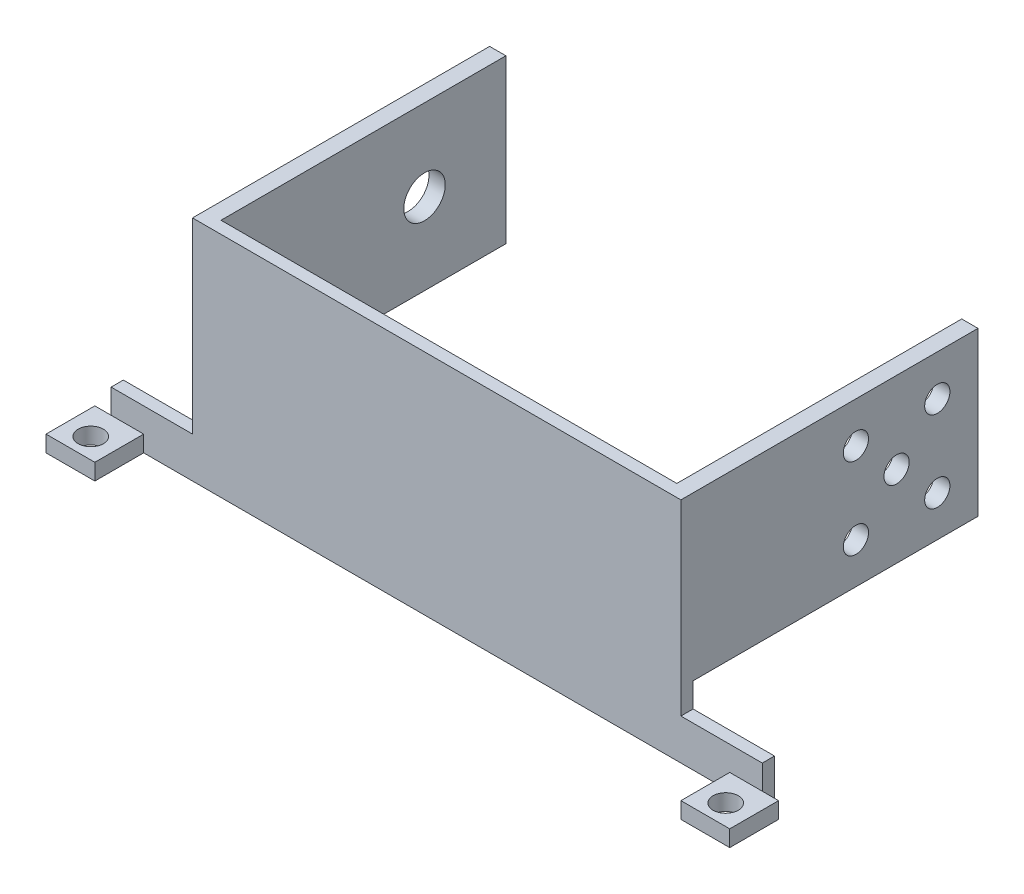
ISO-10303-21;
HEADER;
FILE_DESCRIPTION(('STEP AP214'),'2;1');
FILE_NAME('part.step','',(''),(''),'','','');
FILE_SCHEMA(('AUTOMOTIVE_DESIGN { 1 0 10303 214 1 1 1 1 }'));
ENDSEC;
DATA;
#1=APPLICATION_CONTEXT('core data for automotive mechanical design processes');
#2=APPLICATION_PROTOCOL_DEFINITION('international standard','automotive_design',2000,#1);
#3=PRODUCT_CONTEXT('',#1,'mechanical');
#4=PRODUCT('Part','Part','',(#3));
#5=PRODUCT_RELATED_PRODUCT_CATEGORY('part','',(#4));
#6=PRODUCT_DEFINITION_FORMATION('','',#4);
#7=PRODUCT_DEFINITION_CONTEXT('part definition',#1,'design');
#8=PRODUCT_DEFINITION('design','',#6,#7);
#9=PRODUCT_DEFINITION_SHAPE('','',#8);
#10=(LENGTH_UNIT() NAMED_UNIT(*) SI_UNIT(.MILLI.,.METRE.));
#11=(NAMED_UNIT(*) PLANE_ANGLE_UNIT() SI_UNIT($,.RADIAN.));
#12=(NAMED_UNIT(*) SI_UNIT($,.STERADIAN.) SOLID_ANGLE_UNIT());
#13=UNCERTAINTY_MEASURE_WITH_UNIT(LENGTH_MEASURE(1.E-05),#10,'distance_accuracy_value','');
#14=(GEOMETRIC_REPRESENTATION_CONTEXT(3) GLOBAL_UNCERTAINTY_ASSIGNED_CONTEXT((#13)) GLOBAL_UNIT_ASSIGNED_CONTEXT((#10,
#11,#12)) REPRESENTATION_CONTEXT('',''));
#15=CARTESIAN_POINT('',(0.,0.,0.));
#16=DIRECTION('',(0.,0.,1.));
#17=DIRECTION('',(1.,0.,0.));
#18=AXIS2_PLACEMENT_3D('',#15,#16,#17);
#19=CARTESIAN_POINT('',(0.,0.,0.));
#20=DIRECTION('',(0.,0.,1.));
#21=DIRECTION('',(1.,0.,0.));
#22=AXIS2_PLACEMENT_3D('',#19,#20,#21);
#23=PLANE('',#22);
#24=DIRECTION('',(-1.,0.,0.));
#25=VECTOR('',#24,1.);
#26=CARTESIAN_POINT('',(30.,-3.99999999999999,0.));
#27=LINE('',#26,#25);
#28=CARTESIAN_POINT('',(30.,-3.99999999999999,0.));
#29=VERTEX_POINT('',#28);
#30=CARTESIAN_POINT('',(28.,-4.,0.));
#31=VERTEX_POINT('',#30);
#32=EDGE_CURVE('E390',#29,#31,#27,.T.);
#33=ORIENTED_EDGE('',*,*,#32,.F.);
#34=DIRECTION('',(0.,1.,0.));
#35=VECTOR('',#34,1.);
#36=CARTESIAN_POINT('',(30.,12.,0.));
#37=LINE('',#36,#35);
#38=CARTESIAN_POINT('',(30.,-7.,0.));
#39=VERTEX_POINT('',#38);
#40=EDGE_CURVE('E218',#39,#29,#37,.T.);
#41=ORIENTED_EDGE('',*,*,#40,.F.);
#42=DIRECTION('',(-1.,0.,0.));
#43=VECTOR('',#42,1.);
#44=CARTESIAN_POINT('',(40.,-7.,0.));
#45=LINE('',#44,#43);
#46=CARTESIAN_POINT('',(40.,-7.,0.));
#47=VERTEX_POINT('',#46);
#48=EDGE_CURVE('E318',#47,#39,#45,.T.);
#49=ORIENTED_EDGE('',*,*,#48,.F.);
#50=DIRECTION('',(0.,1.,0.));
#51=VECTOR('',#50,1.);
#52=CARTESIAN_POINT('',(40.,-7.,0.));
#53=LINE('',#52,#51);
#54=CARTESIAN_POINT('',(40.,-12.,0.));
#55=VERTEX_POINT('',#54);
#56=EDGE_CURVE('E320',#55,#47,#53,.T.);
#57=ORIENTED_EDGE('',*,*,#56,.F.);
#58=DIRECTION('',(1.,0.,0.));
#59=VECTOR('',#58,1.);
#60=CARTESIAN_POINT('',(-30.,-12.,0.));
#61=LINE('',#60,#59);
#62=CARTESIAN_POINT('',(-40.,-12.,0.));
#63=VERTEX_POINT('',#62);
#64=EDGE_CURVE('E357',#63,#55,#61,.T.);
#65=ORIENTED_EDGE('',*,*,#64,.F.);
#66=DIRECTION('',(0.,-1.,0.));
#67=VECTOR('',#66,1.);
#68=CARTESIAN_POINT('',(-40.,-7.,0.));
#69=LINE('',#68,#67);
#70=CARTESIAN_POINT('',(-40.,-7.,0.));
#71=VERTEX_POINT('',#70);
#72=EDGE_CURVE('E336',#71,#63,#69,.T.);
#73=ORIENTED_EDGE('',*,*,#72,.F.);
#74=DIRECTION('',(-1.,0.,0.));
#75=VECTOR('',#74,1.);
#76=CARTESIAN_POINT('',(-27.,-7.,0.));
#77=LINE('',#76,#75);
#78=CARTESIAN_POINT('',(-30.,-7.,0.));
#79=VERTEX_POINT('',#78);
#80=EDGE_CURVE('E339',#79,#71,#77,.T.);
#81=ORIENTED_EDGE('',*,*,#80,.F.);
#82=DIRECTION('',(0.,-1.,0.));
#83=VECTOR('',#82,1.);
#84=CARTESIAN_POINT('',(-30.,12.,0.));
#85=LINE('',#84,#83);
#86=CARTESIAN_POINT('',(-30.,-4.,0.));
#87=VERTEX_POINT('',#86);
#88=EDGE_CURVE('E367',#87,#79,#85,.T.);
#89=ORIENTED_EDGE('',*,*,#88,.F.);
#90=DIRECTION('',(-1.,0.,0.));
#91=VECTOR('',#90,1.);
#92=CARTESIAN_POINT('',(-30.,-4.,0.));
#93=LINE('',#92,#91);
#94=CARTESIAN_POINT('',(-28.,-4.,0.));
#95=VERTEX_POINT('',#94);
#96=EDGE_CURVE('E222',#95,#87,#93,.T.);
#97=ORIENTED_EDGE('',*,*,#96,.F.);
#98=DIRECTION('',(0.,-1.,0.));
#99=VECTOR('',#98,1.);
#100=CARTESIAN_POINT('',(-28.,16.,0.));
#101=LINE('',#100,#99);
#102=CARTESIAN_POINT('',(-28.,16.,0.));
#103=VERTEX_POINT('',#102);
#104=EDGE_CURVE('E219',#103,#95,#101,.T.);
#105=ORIENTED_EDGE('',*,*,#104,.F.);
#106=DIRECTION('',(-1.,0.,0.));
#107=VECTOR('',#106,1.);
#108=CARTESIAN_POINT('',(-30.,16.,0.));
#109=LINE('',#108,#107);
#110=CARTESIAN_POINT('',(28.,16.,0.));
#111=VERTEX_POINT('',#110);
#112=EDGE_CURVE('E58',#111,#103,#109,.T.);
#113=ORIENTED_EDGE('',*,*,#112,.F.);
#114=DIRECTION('',(0.,1.,0.));
#115=VECTOR('',#114,1.);
#116=CARTESIAN_POINT('',(28.,16.,0.));
#117=LINE('',#116,#115);
#118=EDGE_CURVE('E212',#31,#111,#117,.T.);
#119=ORIENTED_EDGE('',*,*,#118,.F.);
#120=EDGE_LOOP('',(#33,#41,#49,#57,#65,#73,#81,#89,#97,#105,#113,#119));
#121=FACE_BOUND('',#120,.T.);
#122=ADVANCED_FACE('F35',(#121),#23,.F.);
#123=CARTESIAN_POINT('',(0.,0.,1.5));
#124=DIRECTION('',(0.,0.,1.));
#125=DIRECTION('',(1.,0.,0.));
#126=AXIS2_PLACEMENT_3D('',#123,#124,#125);
#127=PLANE('',#126);
#128=DIRECTION('',(-1.,0.,0.));
#129=VECTOR('',#128,1.);
#130=CARTESIAN_POINT('',(-36.,-10.,1.5));
#131=LINE('',#130,#129);
#132=CARTESIAN_POINT('',(-36.,-10.,1.5));
#133=VERTEX_POINT('',#132);
#134=CARTESIAN_POINT('',(-40.,-10.,1.5));
#135=VERTEX_POINT('',#134);
#136=EDGE_CURVE('E270',#133,#135,#131,.T.);
#137=ORIENTED_EDGE('',*,*,#136,.F.);
#138=DIRECTION('',(0.,1.,0.));
#139=VECTOR('',#138,1.);
#140=CARTESIAN_POINT('',(-36.,-10.,1.5));
#141=LINE('',#140,#139);
#142=CARTESIAN_POINT('',(-36.,-12.,1.5));
#143=VERTEX_POINT('',#142);
#144=EDGE_CURVE('E265',#143,#133,#141,.T.);
#145=ORIENTED_EDGE('',*,*,#144,.F.);
#146=DIRECTION('',(1.,0.,0.));
#147=VECTOR('',#146,1.);
#148=CARTESIAN_POINT('',(-30.,-12.,1.5));
#149=LINE('',#148,#147);
#150=CARTESIAN_POINT('',(36.,-12.,1.5));
#151=VERTEX_POINT('',#150);
#152=EDGE_CURVE('E362',#143,#151,#149,.T.);
#153=ORIENTED_EDGE('',*,*,#152,.T.);
#154=DIRECTION('',(0.,-1.,0.));
#155=VECTOR('',#154,1.);
#156=CARTESIAN_POINT('',(36.,-10.,1.5));
#157=LINE('',#156,#155);
#158=CARTESIAN_POINT('',(36.,-10.,1.5));
#159=VERTEX_POINT('',#158);
#160=EDGE_CURVE('E288',#159,#151,#157,.T.);
#161=ORIENTED_EDGE('',*,*,#160,.F.);
#162=DIRECTION('',(-1.,0.,0.));
#163=VECTOR('',#162,1.);
#164=CARTESIAN_POINT('',(36.,-10.,1.5));
#165=LINE('',#164,#163);
#166=CARTESIAN_POINT('',(40.,-10.,1.5));
#167=VERTEX_POINT('',#166);
#168=EDGE_CURVE('E11',#167,#159,#165,.T.);
#169=ORIENTED_EDGE('',*,*,#168,.F.);
#170=DIRECTION('',(0.,1.,0.));
#171=VECTOR('',#170,1.);
#172=CARTESIAN_POINT('',(40.,-7.,1.5));
#173=LINE('',#172,#171);
#174=CARTESIAN_POINT('',(40.,-7.,1.5));
#175=VERTEX_POINT('',#174);
#176=EDGE_CURVE('E326',#167,#175,#173,.T.);
#177=ORIENTED_EDGE('',*,*,#176,.T.);
#178=DIRECTION('',(-1.,0.,0.));
#179=VECTOR('',#178,1.);
#180=CARTESIAN_POINT('',(27.,-7.,1.5));
#181=LINE('',#180,#179);
#182=CARTESIAN_POINT('',(30.,-7.,1.5));
#183=VERTEX_POINT('',#182);
#184=EDGE_CURVE('E317',#175,#183,#181,.T.);
#185=ORIENTED_EDGE('',*,*,#184,.T.);
#186=DIRECTION('',(0.,1.,0.));
#187=VECTOR('',#186,1.);
#188=CARTESIAN_POINT('',(30.,12.,1.5));
#189=LINE('',#188,#187);
#190=CARTESIAN_POINT('',(30.,16.,1.5));
#191=VERTEX_POINT('',#190);
#192=EDGE_CURVE('E354',#183,#191,#189,.T.);
#193=ORIENTED_EDGE('',*,*,#192,.T.);
#194=DIRECTION('',(-1.,0.,0.));
#195=VECTOR('',#194,1.);
#196=CARTESIAN_POINT('',(-30.,16.,1.5));
#197=LINE('',#196,#195);
#198=CARTESIAN_POINT('',(-30.,16.,1.5));
#199=VERTEX_POINT('',#198);
#200=EDGE_CURVE('E356',#191,#199,#197,.T.);
#201=ORIENTED_EDGE('',*,*,#200,.T.);
#202=DIRECTION('',(0.,-1.,0.));
#203=VECTOR('',#202,1.);
#204=CARTESIAN_POINT('',(-30.,12.,1.5));
#205=LINE('',#204,#203);
#206=CARTESIAN_POINT('',(-30.,-7.,1.5));
#207=VERTEX_POINT('',#206);
#208=EDGE_CURVE('E359',#199,#207,#205,.T.);
#209=ORIENTED_EDGE('',*,*,#208,.T.);
#210=DIRECTION('',(-1.,0.,0.));
#211=VECTOR('',#210,1.);
#212=CARTESIAN_POINT('',(-40.,-7.,1.5));
#213=LINE('',#212,#211);
#214=CARTESIAN_POINT('',(-40.,-7.,1.5));
#215=VERTEX_POINT('',#214);
#216=EDGE_CURVE('E340',#207,#215,#213,.T.);
#217=ORIENTED_EDGE('',*,*,#216,.T.);
#218=DIRECTION('',(0.,-1.,0.));
#219=VECTOR('',#218,1.);
#220=CARTESIAN_POINT('',(-40.,-7.,1.5));
#221=LINE('',#220,#219);
#222=EDGE_CURVE('E343',#215,#135,#221,.T.);
#223=ORIENTED_EDGE('',*,*,#222,.T.);
#224=EDGE_LOOP('',(#137,#145,#153,#161,#169,#177,#185,#193,#201,#209,#217,#223));
#225=FACE_BOUND('',#224,.T.);
#226=ADVANCED_FACE('F434',(#225),#127,.T.);
#227=CARTESIAN_POINT('',(30.,12.,1.5));
#228=DIRECTION('',(-1.,0.,0.));
#229=DIRECTION('',(0.,0.,1.));
#230=AXIS2_PLACEMENT_3D('',#227,#228,#229);
#231=PLANE('',#230);
#232=CARTESIAN_POINT('',(30.,11.,-20.));
#233=DIRECTION('',(1.,0.,0.));
#234=DIRECTION('',(0.,0.,-1.));
#235=AXIS2_PLACEMENT_3D('',#232,#233,#234);
#236=CIRCLE('',#235,1.55);
#237=CARTESIAN_POINT('',(30.,11.,-21.55));
#238=VERTEX_POINT('',#237);
#239=EDGE_CURVE('E401',#238,#238,#236,.T.);
#240=ORIENTED_EDGE('',*,*,#239,.F.);
#241=EDGE_LOOP('',(#240));
#242=FACE_BOUND('',#241,.T.);
#243=CARTESIAN_POINT('',(30.,1.00000000000003,-20.));
#244=DIRECTION('',(1.,0.,0.));
#245=DIRECTION('',(0.,0.,1.));
#246=AXIS2_PLACEMENT_3D('',#243,#244,#245);
#247=CIRCLE('',#246,1.55);
#248=CARTESIAN_POINT('',(30.,1.00000000000003,-18.45));
#249=VERTEX_POINT('',#248);
#250=EDGE_CURVE('E404',#249,#249,#247,.T.);
#251=ORIENTED_EDGE('',*,*,#250,.F.);
#252=EDGE_LOOP('',(#251));
#253=FACE_BOUND('',#252,.T.);
#254=CARTESIAN_POINT('',(30.,1.00000000000001,-30.));
#255=DIRECTION('',(1.,0.,0.));
#256=DIRECTION('',(0.,0.,1.));
#257=AXIS2_PLACEMENT_3D('',#254,#255,#256);
#258=CIRCLE('',#257,1.55);
#259=CARTESIAN_POINT('',(30.,1.00000000000001,-28.45));
#260=VERTEX_POINT('',#259);
#261=EDGE_CURVE('E407',#260,#260,#258,.T.);
#262=ORIENTED_EDGE('',*,*,#261,.F.);
#263=EDGE_LOOP('',(#262));
#264=FACE_BOUND('',#263,.T.);
#265=CARTESIAN_POINT('',(30.,11.,-30.));
#266=DIRECTION('',(1.,0.,0.));
#267=DIRECTION('',(0.,0.,-1.));
#268=AXIS2_PLACEMENT_3D('',#265,#266,#267);
#269=CIRCLE('',#268,1.55);
#270=CARTESIAN_POINT('',(30.,11.,-31.55));
#271=VERTEX_POINT('',#270);
#272=EDGE_CURVE('E400',#271,#271,#269,.T.);
#273=ORIENTED_EDGE('',*,*,#272,.F.);
#274=EDGE_LOOP('',(#273));
#275=FACE_BOUND('',#274,.T.);
#276=CARTESIAN_POINT('',(30.,6.00000000000001,-25.));
#277=DIRECTION('',(1.,0.,0.));
#278=DIRECTION('',(0.,0.,-1.));
#279=AXIS2_PLACEMENT_3D('',#276,#277,#278);
#280=CIRCLE('',#279,1.55);
#281=CARTESIAN_POINT('',(30.,6.00000000000001,-26.55));
#282=VERTEX_POINT('',#281);
#283=EDGE_CURVE('E380',#282,#282,#280,.T.);
#284=ORIENTED_EDGE('',*,*,#283,.F.);
#285=EDGE_LOOP('',(#284));
#286=FACE_BOUND('',#285,.T.);
#287=ORIENTED_EDGE('',*,*,#192,.F.);
#288=DIRECTION('',(0.,0.,-1.));
#289=VECTOR('',#288,1.);
#290=CARTESIAN_POINT('',(30.,-7.,1.5));
#291=LINE('',#290,#289);
#292=EDGE_CURVE('E332',#183,#39,#291,.T.);
#293=ORIENTED_EDGE('',*,*,#292,.T.);
#294=ORIENTED_EDGE('',*,*,#40,.T.);
#295=DIRECTION('',(0.,0.,1.));
#296=VECTOR('',#295,1.);
#297=CARTESIAN_POINT('',(30.,-3.99999999999999,-35.));
#298=LINE('',#297,#296);
#299=CARTESIAN_POINT('',(30.,-3.99999999999999,-35.));
#300=VERTEX_POINT('',#299);
#301=EDGE_CURVE('E197',#300,#29,#298,.T.);
#302=ORIENTED_EDGE('',*,*,#301,.F.);
#303=DIRECTION('',(0.,-1.,0.));
#304=VECTOR('',#303,1.);
#305=CARTESIAN_POINT('',(30.,16.,-35.));
#306=LINE('',#305,#304);
#307=CARTESIAN_POINT('',(30.,16.,-35.));
#308=VERTEX_POINT('',#307);
#309=EDGE_CURVE('E204',#308,#300,#306,.T.);
#310=ORIENTED_EDGE('',*,*,#309,.F.);
#311=DIRECTION('',(0.,0.,-1.));
#312=VECTOR('',#311,1.);
#313=CARTESIAN_POINT('',(30.,16.,1.5));
#314=LINE('',#313,#312);
#315=EDGE_CURVE('E44',#191,#308,#314,.T.);
#316=ORIENTED_EDGE('',*,*,#315,.F.);
#317=EDGE_LOOP('',(#287,#293,#294,#302,#310,#316));
#318=FACE_BOUND('',#317,.T.);
#319=ADVANCED_FACE('F37',(#242,#253,#264,#275,#286,#318),#231,.F.);
#320=CARTESIAN_POINT('',(-30.,16.,1.5));
#321=DIRECTION('',(0.,-1.,0.));
#322=DIRECTION('',(0.,0.,-1.));
#323=AXIS2_PLACEMENT_3D('',#320,#321,#322);
#324=PLANE('',#323);
#325=ORIENTED_EDGE('',*,*,#315,.T.);
#326=DIRECTION('',(1.,0.,0.));
#327=VECTOR('',#326,1.);
#328=CARTESIAN_POINT('',(30.,16.,-35.));
#329=LINE('',#328,#327);
#330=CARTESIAN_POINT('',(28.,16.,-35.));
#331=VERTEX_POINT('',#330);
#332=EDGE_CURVE('E209',#331,#308,#329,.T.);
#333=ORIENTED_EDGE('',*,*,#332,.F.);
#334=DIRECTION('',(0.,0.,1.));
#335=VECTOR('',#334,1.);
#336=CARTESIAN_POINT('',(28.,16.,-35.));
#337=LINE('',#336,#335);
#338=EDGE_CURVE('E53',#331,#111,#337,.T.);
#339=ORIENTED_EDGE('',*,*,#338,.T.);
#340=ORIENTED_EDGE('',*,*,#112,.T.);
#341=DIRECTION('',(0.,0.,1.));
#342=VECTOR('',#341,1.);
#343=CARTESIAN_POINT('',(-28.,16.,-35.));
#344=LINE('',#343,#342);
#345=CARTESIAN_POINT('',(-28.,16.,-35.));
#346=VERTEX_POINT('',#345);
#347=EDGE_CURVE('E244',#346,#103,#344,.T.);
#348=ORIENTED_EDGE('',*,*,#347,.F.);
#349=DIRECTION('',(1.,0.,0.));
#350=VECTOR('',#349,1.);
#351=CARTESIAN_POINT('',(-30.,16.,-35.));
#352=LINE('',#351,#350);
#353=CARTESIAN_POINT('',(-30.,16.,-35.));
#354=VERTEX_POINT('',#353);
#355=EDGE_CURVE('E230',#354,#346,#352,.T.);
#356=ORIENTED_EDGE('',*,*,#355,.F.);
#357=DIRECTION('',(0.,0.,-1.));
#358=VECTOR('',#357,1.);
#359=CARTESIAN_POINT('',(-30.,16.,1.5));
#360=LINE('',#359,#358);
#361=EDGE_CURVE('E364',#199,#354,#360,.T.);
#362=ORIENTED_EDGE('',*,*,#361,.F.);
#363=ORIENTED_EDGE('',*,*,#200,.F.);
#364=EDGE_LOOP('',(#325,#333,#339,#340,#348,#356,#362,#363));
#365=FACE_BOUND('',#364,.T.);
#366=ADVANCED_FACE('F451',(#365),#324,.F.);
#367=CARTESIAN_POINT('',(-30.,12.,1.5));
#368=DIRECTION('',(1.,0.,0.));
#369=DIRECTION('',(0.,1.,0.));
#370=AXIS2_PLACEMENT_3D('',#367,#368,#369);
#371=PLANE('',#370);
#372=CARTESIAN_POINT('',(-30.,6.00000000000001,-25.));
#373=DIRECTION('',(-1.,0.,0.));
#374=DIRECTION('',(0.,-1.,0.));
#375=AXIS2_PLACEMENT_3D('',#372,#373,#374);
#376=CIRCLE('',#375,2.55);
#377=CARTESIAN_POINT('',(-30.,3.45000000000001,-25.));
#378=VERTEX_POINT('',#377);
#379=EDGE_CURVE('E412',#378,#378,#376,.T.);
#380=ORIENTED_EDGE('',*,*,#379,.F.);
#381=EDGE_LOOP('',(#380));
#382=FACE_BOUND('',#381,.T.);
#383=ORIENTED_EDGE('',*,*,#361,.T.);
#384=DIRECTION('',(0.,1.,0.));
#385=VECTOR('',#384,1.);
#386=CARTESIAN_POINT('',(-30.,16.,-35.));
#387=LINE('',#386,#385);
#388=CARTESIAN_POINT('',(-30.,-4.,-35.));
#389=VERTEX_POINT('',#388);
#390=EDGE_CURVE('E227',#389,#354,#387,.T.);
#391=ORIENTED_EDGE('',*,*,#390,.F.);
#392=DIRECTION('',(0.,0.,1.));
#393=VECTOR('',#392,1.);
#394=CARTESIAN_POINT('',(-30.,-4.,-35.));
#395=LINE('',#394,#393);
#396=EDGE_CURVE('E235',#389,#87,#395,.T.);
#397=ORIENTED_EDGE('',*,*,#396,.T.);
#398=ORIENTED_EDGE('',*,*,#88,.T.);
#399=DIRECTION('',(0.,0.,1.));
#400=VECTOR('',#399,1.);
#401=CARTESIAN_POINT('',(-30.,-7.,1.5));
#402=LINE('',#401,#400);
#403=EDGE_CURVE('E350',#79,#207,#402,.T.);
#404=ORIENTED_EDGE('',*,*,#403,.T.);
#405=ORIENTED_EDGE('',*,*,#208,.F.);
#406=EDGE_LOOP('',(#383,#391,#397,#398,#404,#405));
#407=FACE_BOUND('',#406,.T.);
#408=ADVANCED_FACE('F448',(#382,#407),#371,.F.);
#409=CARTESIAN_POINT('',(-30.,-12.,1.5));
#410=DIRECTION('',(0.,1.,0.));
#411=DIRECTION('',(0.,0.,1.));
#412=AXIS2_PLACEMENT_3D('',#409,#410,#411);
#413=PLANE('',#412);
#414=CARTESIAN_POINT('',(39.,-12.,5.));
#415=DIRECTION('',(0.,-1.,0.));
#416=DIRECTION('',(0.,0.,-1.));
#417=AXIS2_PLACEMENT_3D('',#414,#415,#416);
#418=CIRCLE('',#417,1.55);
#419=CARTESIAN_POINT('',(39.,-12.,3.45));
#420=VERTEX_POINT('',#419);
#421=EDGE_CURVE('E248',#420,#420,#418,.T.);
#422=ORIENTED_EDGE('',*,*,#421,.F.);
#423=EDGE_LOOP('',(#422));
#424=FACE_BOUND('',#423,.T.);
#425=CARTESIAN_POINT('',(-39.,-12.,5.));
#426=DIRECTION('',(0.,-1.,0.));
#427=DIRECTION('',(0.,0.,1.));
#428=AXIS2_PLACEMENT_3D('',#425,#426,#427);
#429=CIRCLE('',#428,1.55);
#430=CARTESIAN_POINT('',(-39.,-12.,6.55));
#431=VERTEX_POINT('',#430);
#432=EDGE_CURVE('E247',#431,#431,#429,.T.);
#433=ORIENTED_EDGE('',*,*,#432,.F.);
#434=EDGE_LOOP('',(#433));
#435=FACE_BOUND('',#434,.T.);
#436=ORIENTED_EDGE('',*,*,#64,.T.);
#437=DIRECTION('',(0.,0.,1.));
#438=VECTOR('',#437,1.);
#439=CARTESIAN_POINT('',(40.,-12.,0.));
#440=LINE('',#439,#438);
#441=CARTESIAN_POINT('',(40.,-12.,1.5));
#442=VERTEX_POINT('',#441);
#443=EDGE_CURVE('E324',#55,#442,#440,.T.);
#444=ORIENTED_EDGE('',*,*,#443,.T.);
#445=DIRECTION('',(1.,0.,0.));
#446=VECTOR('',#445,1.);
#447=CARTESIAN_POINT('',(36.,-12.,1.5));
#448=LINE('',#447,#446);
#449=CARTESIAN_POINT('',(42.,-12.,1.5));
#450=VERTEX_POINT('',#449);
#451=EDGE_CURVE('E301',#442,#450,#448,.T.);
#452=ORIENTED_EDGE('',*,*,#451,.T.);
#453=DIRECTION('',(0.,0.,-1.));
#454=VECTOR('',#453,1.);
#455=CARTESIAN_POINT('',(42.,-12.,7.5));
#456=LINE('',#455,#454);
#457=CARTESIAN_POINT('',(42.,-12.,7.5));
#458=VERTEX_POINT('',#457);
#459=EDGE_CURVE('E311',#458,#450,#456,.T.);
#460=ORIENTED_EDGE('',*,*,#459,.F.);
#461=DIRECTION('',(1.,0.,0.));
#462=VECTOR('',#461,1.);
#463=CARTESIAN_POINT('',(36.,-12.,7.5));
#464=LINE('',#463,#462);
#465=CARTESIAN_POINT('',(36.,-12.,7.5));
#466=VERTEX_POINT('',#465);
#467=EDGE_CURVE('E292',#466,#458,#464,.T.);
#468=ORIENTED_EDGE('',*,*,#467,.F.);
#469=DIRECTION('',(0.,0.,-1.));
#470=VECTOR('',#469,1.);
#471=CARTESIAN_POINT('',(36.,-12.,7.5));
#472=LINE('',#471,#470);
#473=EDGE_CURVE('E314',#466,#151,#472,.T.);
#474=ORIENTED_EDGE('',*,*,#473,.T.);
#475=ORIENTED_EDGE('',*,*,#152,.F.);
#476=DIRECTION('',(0.,0.,-1.));
#477=VECTOR('',#476,1.);
#478=CARTESIAN_POINT('',(-36.,-12.,7.5));
#479=LINE('',#478,#477);
#480=CARTESIAN_POINT('',(-36.,-12.,7.5));
#481=VERTEX_POINT('',#480);
#482=EDGE_CURVE('E264',#481,#143,#479,.T.);
#483=ORIENTED_EDGE('',*,*,#482,.F.);
#484=DIRECTION('',(1.,0.,0.));
#485=VECTOR('',#484,1.);
#486=CARTESIAN_POINT('',(-36.,-12.,7.5));
#487=LINE('',#486,#485);
#488=CARTESIAN_POINT('',(-42.,-12.,7.5));
#489=VERTEX_POINT('',#488);
#490=EDGE_CURVE('E262',#489,#481,#487,.T.);
#491=ORIENTED_EDGE('',*,*,#490,.F.);
#492=DIRECTION('',(0.,0.,-1.));
#493=VECTOR('',#492,1.);
#494=CARTESIAN_POINT('',(-42.,-12.,7.5));
#495=LINE('',#494,#493);
#496=CARTESIAN_POINT('',(-42.,-12.,1.5));
#497=VERTEX_POINT('',#496);
#498=EDGE_CURVE('E279',#489,#497,#495,.T.);
#499=ORIENTED_EDGE('',*,*,#498,.T.);
#500=DIRECTION('',(1.,0.,0.));
#501=VECTOR('',#500,1.);
#502=CARTESIAN_POINT('',(-36.,-12.,1.5));
#503=LINE('',#502,#501);
#504=CARTESIAN_POINT('',(-40.,-12.,1.5));
#505=VERTEX_POINT('',#504);
#506=EDGE_CURVE('E258',#497,#505,#503,.T.);
#507=ORIENTED_EDGE('',*,*,#506,.T.);
#508=DIRECTION('',(0.,0.,1.));
#509=VECTOR('',#508,1.);
#510=CARTESIAN_POINT('',(-40.,-12.,0.));
#511=LINE('',#510,#509);
#512=EDGE_CURVE('E342',#63,#505,#511,.T.);
#513=ORIENTED_EDGE('',*,*,#512,.F.);
#514=EDGE_LOOP('',(#436,#444,#452,#460,#468,#474,#475,#483,#491,#499,#507,#513));
#515=FACE_BOUND('',#514,.T.);
#516=ADVANCED_FACE('F444',(#424,#435,#515),#413,.F.);
#517=CARTESIAN_POINT('',(-40.,-7.,0.));
#518=DIRECTION('',(0.,1.,0.));
#519=DIRECTION('',(-1.,0.,0.));
#520=AXIS2_PLACEMENT_3D('',#517,#518,#519);
#521=PLANE('',#520);
#522=ORIENTED_EDGE('',*,*,#403,.F.);
#523=ORIENTED_EDGE('',*,*,#80,.T.);
#524=DIRECTION('',(0.,0.,1.));
#525=VECTOR('',#524,1.);
#526=CARTESIAN_POINT('',(-40.,-7.,0.));
#527=LINE('',#526,#525);
#528=EDGE_CURVE('E347',#71,#215,#527,.T.);
#529=ORIENTED_EDGE('',*,*,#528,.T.);
#530=ORIENTED_EDGE('',*,*,#216,.F.);
#531=EDGE_LOOP('',(#522,#523,#529,#530));
#532=FACE_BOUND('',#531,.T.);
#533=ADVANCED_FACE('F447',(#532),#521,.T.);
#534=CARTESIAN_POINT('',(-40.,-7.,0.));
#535=DIRECTION('',(-1.,0.,0.));
#536=DIRECTION('',(0.,0.,1.));
#537=AXIS2_PLACEMENT_3D('',#534,#535,#536);
#538=PLANE('',#537);
#539=ORIENTED_EDGE('',*,*,#222,.F.);
#540=ORIENTED_EDGE('',*,*,#528,.F.);
#541=ORIENTED_EDGE('',*,*,#72,.T.);
#542=ORIENTED_EDGE('',*,*,#512,.T.);
#543=EDGE_CURVE('E335',#135,#505,#221,.T.);
#544=ORIENTED_EDGE('',*,*,#543,.F.);
#545=EDGE_LOOP('',(#539,#540,#541,#542,#544));
#546=FACE_BOUND('',#545,.T.);
#547=ADVANCED_FACE('F480',(#546),#538,.T.);
#548=CARTESIAN_POINT('',(27.,-7.,0.));
#549=DIRECTION('',(0.,1.,0.));
#550=DIRECTION('',(-1.,0.,0.));
#551=AXIS2_PLACEMENT_3D('',#548,#549,#550);
#552=PLANE('',#551);
#553=ORIENTED_EDGE('',*,*,#292,.F.);
#554=ORIENTED_EDGE('',*,*,#184,.F.);
#555=DIRECTION('',(0.,0.,1.));
#556=VECTOR('',#555,1.);
#557=CARTESIAN_POINT('',(40.,-7.,0.));
#558=LINE('',#557,#556);
#559=EDGE_CURVE('E329',#47,#175,#558,.T.);
#560=ORIENTED_EDGE('',*,*,#559,.F.);
#561=ORIENTED_EDGE('',*,*,#48,.T.);
#562=EDGE_LOOP('',(#553,#554,#560,#561));
#563=FACE_BOUND('',#562,.T.);
#564=ADVANCED_FACE('F464',(#563),#552,.T.);
#565=CARTESIAN_POINT('',(40.,-7.,0.));
#566=DIRECTION('',(1.,0.,0.));
#567=DIRECTION('',(0.,0.,-1.));
#568=AXIS2_PLACEMENT_3D('',#565,#566,#567);
#569=PLANE('',#568);
#570=EDGE_CURVE('E321',#442,#167,#173,.T.);
#571=ORIENTED_EDGE('',*,*,#570,.F.);
#572=ORIENTED_EDGE('',*,*,#443,.F.);
#573=ORIENTED_EDGE('',*,*,#56,.T.);
#574=ORIENTED_EDGE('',*,*,#559,.T.);
#575=ORIENTED_EDGE('',*,*,#176,.F.);
#576=EDGE_LOOP('',(#571,#572,#573,#574,#575));
#577=FACE_BOUND('',#576,.T.);
#578=ADVANCED_FACE('F470',(#577),#569,.T.);
#579=CARTESIAN_POINT('',(0.,0.,1.5));
#580=DIRECTION('',(0.,0.,1.));
#581=DIRECTION('',(1.,0.,0.));
#582=AXIS2_PLACEMENT_3D('',#579,#580,#581);
#583=PLANE('',#582);
#584=ORIENTED_EDGE('',*,*,#451,.F.);
#585=ORIENTED_EDGE('',*,*,#570,.T.);
#586=CARTESIAN_POINT('',(42.,-10.,1.5));
#587=VERTEX_POINT('',#586);
#588=EDGE_CURVE('E46',#587,#167,#165,.T.);
#589=ORIENTED_EDGE('',*,*,#588,.F.);
#590=DIRECTION('',(0.,1.,0.));
#591=VECTOR('',#590,1.);
#592=CARTESIAN_POINT('',(42.,-10.,1.5));
#593=LINE('',#592,#591);
#594=EDGE_CURVE('E303',#450,#587,#593,.T.);
#595=ORIENTED_EDGE('',*,*,#594,.F.);
#596=EDGE_LOOP('',(#584,#585,#589,#595));
#597=FACE_BOUND('',#596,.T.);
#598=ADVANCED_FACE('F513',(#597),#583,.F.);
#599=CARTESIAN_POINT('',(36.,-10.,7.5));
#600=DIRECTION('',(1.,0.,0.));
#601=DIRECTION('',(0.,0.,-1.));
#602=AXIS2_PLACEMENT_3D('',#599,#600,#601);
#603=PLANE('',#602);
#604=ORIENTED_EDGE('',*,*,#160,.T.);
#605=ORIENTED_EDGE('',*,*,#473,.F.);
#606=DIRECTION('',(0.,-1.,0.));
#607=VECTOR('',#606,1.);
#608=CARTESIAN_POINT('',(36.,-10.,7.5));
#609=LINE('',#608,#607);
#610=CARTESIAN_POINT('',(36.,-10.,7.5));
#611=VERTEX_POINT('',#610);
#612=EDGE_CURVE('E289',#611,#466,#609,.T.);
#613=ORIENTED_EDGE('',*,*,#612,.F.);
#614=DIRECTION('',(0.,0.,-1.));
#615=VECTOR('',#614,1.);
#616=CARTESIAN_POINT('',(36.,-10.,7.5));
#617=LINE('',#616,#615);
#618=EDGE_CURVE('E298',#611,#159,#617,.T.);
#619=ORIENTED_EDGE('',*,*,#618,.T.);
#620=EDGE_LOOP('',(#604,#605,#613,#619));
#621=FACE_BOUND('',#620,.T.);
#622=ADVANCED_FACE('F504',(#621),#603,.F.);
#623=CARTESIAN_POINT('',(42.,-10.,7.5));
#624=DIRECTION('',(-1.,0.,0.));
#625=DIRECTION('',(0.,0.,1.));
#626=AXIS2_PLACEMENT_3D('',#623,#624,#625);
#627=PLANE('',#626);
#628=ORIENTED_EDGE('',*,*,#594,.T.);
#629=DIRECTION('',(0.,0.,-1.));
#630=VECTOR('',#629,1.);
#631=CARTESIAN_POINT('',(42.,-10.,7.5));
#632=LINE('',#631,#630);
#633=CARTESIAN_POINT('',(42.,-10.,7.5));
#634=VERTEX_POINT('',#633);
#635=EDGE_CURVE('E308',#634,#587,#632,.T.);
#636=ORIENTED_EDGE('',*,*,#635,.F.);
#637=DIRECTION('',(0.,1.,0.));
#638=VECTOR('',#637,1.);
#639=CARTESIAN_POINT('',(42.,-10.,7.5));
#640=LINE('',#639,#638);
#641=EDGE_CURVE('E294',#458,#634,#640,.T.);
#642=ORIENTED_EDGE('',*,*,#641,.F.);
#643=ORIENTED_EDGE('',*,*,#459,.T.);
#644=EDGE_LOOP('',(#628,#636,#642,#643));
#645=FACE_BOUND('',#644,.T.);
#646=ADVANCED_FACE('F515',(#645),#627,.F.);
#647=CARTESIAN_POINT('',(36.,-10.,7.5));
#648=DIRECTION('',(0.,-1.,0.));
#649=DIRECTION('',(0.,0.,-1.));
#650=AXIS2_PLACEMENT_3D('',#647,#648,#649);
#651=PLANE('',#650);
#652=CARTESIAN_POINT('',(39.,-10.,5.));
#653=DIRECTION('',(0.,-1.,0.));
#654=DIRECTION('',(0.,0.,-1.));
#655=AXIS2_PLACEMENT_3D('',#652,#653,#654);
#656=CIRCLE('',#655,1.55);
#657=CARTESIAN_POINT('',(39.,-10.,3.45));
#658=VERTEX_POINT('',#657);
#659=EDGE_CURVE('E269',#658,#658,#656,.T.);
#660=ORIENTED_EDGE('',*,*,#659,.T.);
#661=EDGE_LOOP('',(#660));
#662=FACE_BOUND('',#661,.T.);
#663=ORIENTED_EDGE('',*,*,#588,.T.);
#664=ORIENTED_EDGE('',*,*,#168,.T.);
#665=ORIENTED_EDGE('',*,*,#618,.F.);
#666=DIRECTION('',(-1.,0.,0.));
#667=VECTOR('',#666,1.);
#668=CARTESIAN_POINT('',(36.,-10.,7.5));
#669=LINE('',#668,#667);
#670=EDGE_CURVE('E296',#634,#611,#669,.T.);
#671=ORIENTED_EDGE('',*,*,#670,.F.);
#672=ORIENTED_EDGE('',*,*,#635,.T.);
#673=EDGE_LOOP('',(#663,#664,#665,#671,#672));
#674=FACE_BOUND('',#673,.T.);
#675=ADVANCED_FACE('F507',(#662,#674),#651,.F.);
#676=CARTESIAN_POINT('',(0.,0.,7.5));
#677=DIRECTION('',(0.,0.,1.));
#678=DIRECTION('',(1.,0.,0.));
#679=AXIS2_PLACEMENT_3D('',#676,#677,#678);
#680=PLANE('',#679);
#681=ORIENTED_EDGE('',*,*,#612,.T.);
#682=ORIENTED_EDGE('',*,*,#467,.T.);
#683=ORIENTED_EDGE('',*,*,#641,.T.);
#684=ORIENTED_EDGE('',*,*,#670,.T.);
#685=EDGE_LOOP('',(#681,#682,#683,#684));
#686=FACE_BOUND('',#685,.T.);
#687=ADVANCED_FACE('F518',(#686),#680,.T.);
#688=CARTESIAN_POINT('',(-36.,-10.,7.5));
#689=DIRECTION('',(-1.,0.,0.));
#690=DIRECTION('',(0.,-1.,0.));
#691=AXIS2_PLACEMENT_3D('',#688,#689,#690);
#692=PLANE('',#691);
#693=ORIENTED_EDGE('',*,*,#144,.T.);
#694=DIRECTION('',(0.,0.,-1.));
#695=VECTOR('',#694,1.);
#696=CARTESIAN_POINT('',(-36.,-10.,7.5));
#697=LINE('',#696,#695);
#698=CARTESIAN_POINT('',(-36.,-10.,7.5));
#699=VERTEX_POINT('',#698);
#700=EDGE_CURVE('E285',#699,#133,#697,.T.);
#701=ORIENTED_EDGE('',*,*,#700,.F.);
#702=DIRECTION('',(0.,1.,0.));
#703=VECTOR('',#702,1.);
#704=CARTESIAN_POINT('',(-36.,-10.,7.5));
#705=LINE('',#704,#703);
#706=EDGE_CURVE('E254',#481,#699,#705,.T.);
#707=ORIENTED_EDGE('',*,*,#706,.F.);
#708=ORIENTED_EDGE('',*,*,#482,.T.);
#709=EDGE_LOOP('',(#693,#701,#707,#708));
#710=FACE_BOUND('',#709,.T.);
#711=ADVANCED_FACE('F497',(#710),#692,.F.);
#712=CARTESIAN_POINT('',(-36.,-10.,7.5));
#713=DIRECTION('',(0.,-1.,0.));
#714=DIRECTION('',(0.,0.,-1.));
#715=AXIS2_PLACEMENT_3D('',#712,#713,#714);
#716=PLANE('',#715);
#717=CARTESIAN_POINT('',(-39.,-10.,5.));
#718=DIRECTION('',(0.,-1.,0.));
#719=DIRECTION('',(0.,0.,-1.));
#720=AXIS2_PLACEMENT_3D('',#717,#718,#719);
#721=CIRCLE('',#720,1.55);
#722=CARTESIAN_POINT('',(-39.,-10.,3.45));
#723=VERTEX_POINT('',#722);
#724=EDGE_CURVE('E251',#723,#723,#721,.T.);
#725=ORIENTED_EDGE('',*,*,#724,.T.);
#726=EDGE_LOOP('',(#725));
#727=FACE_BOUND('',#726,.T.);
#728=ORIENTED_EDGE('',*,*,#136,.T.);
#729=CARTESIAN_POINT('',(-42.,-10.,1.5));
#730=VERTEX_POINT('',#729);
#731=EDGE_CURVE('E268',#135,#730,#131,.T.);
#732=ORIENTED_EDGE('',*,*,#731,.T.);
#733=DIRECTION('',(0.,0.,-1.));
#734=VECTOR('',#733,1.);
#735=CARTESIAN_POINT('',(-42.,-10.,7.5));
#736=LINE('',#735,#734);
#737=CARTESIAN_POINT('',(-42.,-10.,7.5));
#738=VERTEX_POINT('',#737);
#739=EDGE_CURVE('E282',#738,#730,#736,.T.);
#740=ORIENTED_EDGE('',*,*,#739,.F.);
#741=DIRECTION('',(-1.,0.,0.));
#742=VECTOR('',#741,1.);
#743=CARTESIAN_POINT('',(-36.,-10.,7.5));
#744=LINE('',#743,#742);
#745=EDGE_CURVE('E257',#699,#738,#744,.T.);
#746=ORIENTED_EDGE('',*,*,#745,.F.);
#747=ORIENTED_EDGE('',*,*,#700,.T.);
#748=EDGE_LOOP('',(#728,#732,#740,#746,#747));
#749=FACE_BOUND('',#748,.T.);
#750=ADVANCED_FACE('F493',(#727,#749),#716,.F.);
#751=CARTESIAN_POINT('',(-42.,-10.,7.5));
#752=DIRECTION('',(1.,0.,0.));
#753=DIRECTION('',(0.,0.,-1.));
#754=AXIS2_PLACEMENT_3D('',#751,#752,#753);
#755=PLANE('',#754);
#756=DIRECTION('',(0.,-1.,0.));
#757=VECTOR('',#756,1.);
#758=CARTESIAN_POINT('',(-42.,-10.,1.5));
#759=LINE('',#758,#757);
#760=EDGE_CURVE('E273',#730,#497,#759,.T.);
#761=ORIENTED_EDGE('',*,*,#760,.T.);
#762=ORIENTED_EDGE('',*,*,#498,.F.);
#763=DIRECTION('',(0.,-1.,0.));
#764=VECTOR('',#763,1.);
#765=CARTESIAN_POINT('',(-42.,-10.,7.5));
#766=LINE('',#765,#764);
#767=EDGE_CURVE('E260',#738,#489,#766,.T.);
#768=ORIENTED_EDGE('',*,*,#767,.F.);
#769=ORIENTED_EDGE('',*,*,#739,.T.);
#770=EDGE_LOOP('',(#761,#762,#768,#769));
#771=FACE_BOUND('',#770,.T.);
#772=ADVANCED_FACE('F585',(#771),#755,.F.);
#773=CARTESIAN_POINT('',(0.,0.,7.5));
#774=DIRECTION('',(0.,0.,-1.));
#775=DIRECTION('',(-1.,0.,0.));
#776=AXIS2_PLACEMENT_3D('',#773,#774,#775);
#777=PLANE('',#776);
#778=ORIENTED_EDGE('',*,*,#706,.T.);
#779=ORIENTED_EDGE('',*,*,#745,.T.);
#780=ORIENTED_EDGE('',*,*,#767,.T.);
#781=ORIENTED_EDGE('',*,*,#490,.T.);
#782=EDGE_LOOP('',(#778,#779,#780,#781));
#783=FACE_BOUND('',#782,.T.);
#784=ADVANCED_FACE('F741',(#783),#777,.F.);
#785=CARTESIAN_POINT('',(0.,0.,1.5));
#786=DIRECTION('',(0.,0.,-1.));
#787=DIRECTION('',(-1.,0.,0.));
#788=AXIS2_PLACEMENT_3D('',#785,#786,#787);
#789=PLANE('',#788);
#790=ORIENTED_EDGE('',*,*,#731,.F.);
#791=ORIENTED_EDGE('',*,*,#543,.T.);
#792=ORIENTED_EDGE('',*,*,#506,.F.);
#793=ORIENTED_EDGE('',*,*,#760,.F.);
#794=EDGE_LOOP('',(#790,#791,#792,#793));
#795=FACE_BOUND('',#794,.T.);
#796=ADVANCED_FACE('F489',(#795),#789,.T.);
#797=CARTESIAN_POINT('',(-39.,-7.5,5.));
#798=DIRECTION('',(0.,-1.,0.));
#799=DIRECTION('',(0.,0.,-1.));
#800=AXIS2_PLACEMENT_3D('',#797,#798,#799);
#801=CYLINDRICAL_SURFACE('',#800,1.55);
#802=ORIENTED_EDGE('',*,*,#432,.T.);
#803=EDGE_LOOP('',(#802));
#804=FACE_BOUND('',#803,.T.);
#805=ORIENTED_EDGE('',*,*,#724,.F.);
#806=EDGE_LOOP('',(#805));
#807=FACE_BOUND('',#806,.T.);
#808=ADVANCED_FACE('F593',(#804,#807),#801,.F.);
#809=CARTESIAN_POINT('',(39.,-7.5,5.));
#810=DIRECTION('',(0.,-1.,0.));
#811=DIRECTION('',(0.,0.,-1.));
#812=AXIS2_PLACEMENT_3D('',#809,#810,#811);
#813=CYLINDRICAL_SURFACE('',#812,1.55);
#814=ORIENTED_EDGE('',*,*,#421,.T.);
#815=EDGE_LOOP('',(#814));
#816=FACE_BOUND('',#815,.T.);
#817=ORIENTED_EDGE('',*,*,#659,.F.);
#818=EDGE_LOOP('',(#817));
#819=FACE_BOUND('',#818,.T.);
#820=ADVANCED_FACE('F598',(#816,#819),#813,.F.);
#821=CARTESIAN_POINT('',(-28.,16.,-35.));
#822=DIRECTION('',(-1.,0.,0.));
#823=DIRECTION('',(0.,-1.,0.));
#824=AXIS2_PLACEMENT_3D('',#821,#822,#823);
#825=PLANE('',#824);
#826=CARTESIAN_POINT('',(-28.,6.00000000000001,-25.));
#827=DIRECTION('',(-1.,0.,0.));
#828=DIRECTION('',(0.,-1.,0.));
#829=AXIS2_PLACEMENT_3D('',#826,#827,#828);
#830=CIRCLE('',#829,2.55);
#831=CARTESIAN_POINT('',(-28.,3.45000000000001,-25.));
#832=VERTEX_POINT('',#831);
#833=EDGE_CURVE('E39',#832,#832,#830,.T.);
#834=ORIENTED_EDGE('',*,*,#833,.T.);
#835=EDGE_LOOP('',(#834));
#836=FACE_BOUND('',#835,.T.);
#837=ORIENTED_EDGE('',*,*,#104,.T.);
#838=DIRECTION('',(0.,0.,1.));
#839=VECTOR('',#838,1.);
#840=CARTESIAN_POINT('',(-28.,-4.,-35.));
#841=LINE('',#840,#839);
#842=CARTESIAN_POINT('',(-28.,-4.,-35.));
#843=VERTEX_POINT('',#842);
#844=EDGE_CURVE('E241',#843,#95,#841,.T.);
#845=ORIENTED_EDGE('',*,*,#844,.F.);
#846=DIRECTION('',(0.,-1.,0.));
#847=VECTOR('',#846,1.);
#848=CARTESIAN_POINT('',(-28.,16.,-35.));
#849=LINE('',#848,#847);
#850=EDGE_CURVE('E232',#346,#843,#849,.T.);
#851=ORIENTED_EDGE('',*,*,#850,.F.);
#852=ORIENTED_EDGE('',*,*,#347,.T.);
#853=EDGE_LOOP('',(#837,#845,#851,#852));
#854=FACE_BOUND('',#853,.T.);
#855=ADVANCED_FACE('F419',(#836,#854),#825,.F.);
#856=CARTESIAN_POINT('',(-30.,-4.,-35.));
#857=DIRECTION('',(0.,1.,0.));
#858=DIRECTION('',(0.,0.,1.));
#859=AXIS2_PLACEMENT_3D('',#856,#857,#858);
#860=PLANE('',#859);
#861=ORIENTED_EDGE('',*,*,#96,.T.);
#862=ORIENTED_EDGE('',*,*,#396,.F.);
#863=DIRECTION('',(-1.,0.,0.));
#864=VECTOR('',#863,1.);
#865=CARTESIAN_POINT('',(-30.,-4.,-35.));
#866=LINE('',#865,#864);
#867=EDGE_CURVE('E234',#843,#389,#866,.T.);
#868=ORIENTED_EDGE('',*,*,#867,.F.);
#869=ORIENTED_EDGE('',*,*,#844,.T.);
#870=EDGE_LOOP('',(#861,#862,#868,#869));
#871=FACE_BOUND('',#870,.T.);
#872=ADVANCED_FACE('F629',(#871),#860,.F.);
#873=CARTESIAN_POINT('',(0.,0.,-35.));
#874=DIRECTION('',(0.,0.,1.));
#875=DIRECTION('',(1.,0.,0.));
#876=AXIS2_PLACEMENT_3D('',#873,#874,#875);
#877=PLANE('',#876);
#878=ORIENTED_EDGE('',*,*,#390,.T.);
#879=ORIENTED_EDGE('',*,*,#355,.T.);
#880=ORIENTED_EDGE('',*,*,#850,.T.);
#881=ORIENTED_EDGE('',*,*,#867,.T.);
#882=EDGE_LOOP('',(#878,#879,#880,#881));
#883=FACE_BOUND('',#882,.T.);
#884=ADVANCED_FACE('F634',(#883),#877,.F.);
#885=CARTESIAN_POINT('',(30.,-3.99999999999999,-35.));
#886=DIRECTION('',(0.,1.,0.));
#887=DIRECTION('',(-1.,0.,0.));
#888=AXIS2_PLACEMENT_3D('',#885,#886,#887);
#889=PLANE('',#888);
#890=ORIENTED_EDGE('',*,*,#32,.T.);
#891=DIRECTION('',(0.,0.,1.));
#892=VECTOR('',#891,1.);
#893=CARTESIAN_POINT('',(28.,-4.,-35.));
#894=LINE('',#893,#892);
#895=CARTESIAN_POINT('',(28.,-4.,-35.));
#896=VERTEX_POINT('',#895);
#897=EDGE_CURVE('E200',#896,#31,#894,.T.);
#898=ORIENTED_EDGE('',*,*,#897,.F.);
#899=DIRECTION('',(-1.,0.,0.));
#900=VECTOR('',#899,1.);
#901=CARTESIAN_POINT('',(30.,-3.99999999999999,-35.));
#902=LINE('',#901,#900);
#903=EDGE_CURVE('E193',#300,#896,#902,.T.);
#904=ORIENTED_EDGE('',*,*,#903,.F.);
#905=ORIENTED_EDGE('',*,*,#301,.T.);
#906=EDGE_LOOP('',(#890,#898,#904,#905));
#907=FACE_BOUND('',#906,.T.);
#908=ADVANCED_FACE('F195',(#907),#889,.F.);
#909=CARTESIAN_POINT('',(28.,16.,-35.));
#910=DIRECTION('',(1.,0.,0.));
#911=DIRECTION('',(0.,1.,0.));
#912=AXIS2_PLACEMENT_3D('',#909,#910,#911);
#913=PLANE('',#912);
#914=CARTESIAN_POINT('',(28.,11.,-20.));
#915=DIRECTION('',(1.,0.,0.));
#916=DIRECTION('',(0.,1.,0.));
#917=AXIS2_PLACEMENT_3D('',#914,#915,#916);
#918=CIRCLE('',#917,1.55);
#919=CARTESIAN_POINT('',(28.,12.55,-20.));
#920=VERTEX_POINT('',#919);
#921=EDGE_CURVE('E388',#920,#920,#918,.T.);
#922=ORIENTED_EDGE('',*,*,#921,.T.);
#923=EDGE_LOOP('',(#922));
#924=FACE_BOUND('',#923,.T.);
#925=CARTESIAN_POINT('',(28.,1.00000000000003,-20.));
#926=DIRECTION('',(1.,0.,0.));
#927=DIRECTION('',(0.,1.,0.));
#928=AXIS2_PLACEMENT_3D('',#925,#926,#927);
#929=CIRCLE('',#928,1.55);
#930=CARTESIAN_POINT('',(28.,2.55000000000003,-20.));
#931=VERTEX_POINT('',#930);
#932=EDGE_CURVE('E386',#931,#931,#929,.T.);
#933=ORIENTED_EDGE('',*,*,#932,.T.);
#934=EDGE_LOOP('',(#933));
#935=FACE_BOUND('',#934,.T.);
#936=CARTESIAN_POINT('',(28.,1.00000000000001,-30.));
#937=DIRECTION('',(1.,0.,0.));
#938=DIRECTION('',(0.,1.,0.));
#939=AXIS2_PLACEMENT_3D('',#936,#937,#938);
#940=CIRCLE('',#939,1.55);
#941=CARTESIAN_POINT('',(28.,2.55000000000001,-30.));
#942=VERTEX_POINT('',#941);
#943=EDGE_CURVE('E383',#942,#942,#940,.T.);
#944=ORIENTED_EDGE('',*,*,#943,.T.);
#945=EDGE_LOOP('',(#944));
#946=FACE_BOUND('',#945,.T.);
#947=CARTESIAN_POINT('',(28.,11.,-30.));
#948=DIRECTION('',(1.,0.,0.));
#949=DIRECTION('',(0.,1.,0.));
#950=AXIS2_PLACEMENT_3D('',#947,#948,#949);
#951=CIRCLE('',#950,1.55);
#952=CARTESIAN_POINT('',(28.,12.55,-30.));
#953=VERTEX_POINT('',#952);
#954=EDGE_CURVE('E379',#953,#953,#951,.T.);
#955=ORIENTED_EDGE('',*,*,#954,.T.);
#956=EDGE_LOOP('',(#955));
#957=FACE_BOUND('',#956,.T.);
#958=CARTESIAN_POINT('',(28.,6.00000000000001,-25.));
#959=DIRECTION('',(1.,0.,0.));
#960=DIRECTION('',(0.,1.,0.));
#961=AXIS2_PLACEMENT_3D('',#958,#959,#960);
#962=CIRCLE('',#961,1.55);
#963=CARTESIAN_POINT('',(28.,7.55000000000001,-25.));
#964=VERTEX_POINT('',#963);
#965=EDGE_CURVE('E376',#964,#964,#962,.T.);
#966=ORIENTED_EDGE('',*,*,#965,.T.);
#967=EDGE_LOOP('',(#966));
#968=FACE_BOUND('',#967,.T.);
#969=ORIENTED_EDGE('',*,*,#118,.T.);
#970=ORIENTED_EDGE('',*,*,#338,.F.);
#971=DIRECTION('',(0.,1.,0.));
#972=VECTOR('',#971,1.);
#973=CARTESIAN_POINT('',(28.,16.,-35.));
#974=LINE('',#973,#972);
#975=EDGE_CURVE('E203',#896,#331,#974,.T.);
#976=ORIENTED_EDGE('',*,*,#975,.F.);
#977=ORIENTED_EDGE('',*,*,#897,.T.);
#978=EDGE_LOOP('',(#969,#970,#976,#977));
#979=FACE_BOUND('',#978,.T.);
#980=ADVANCED_FACE('F654',(#924,#935,#946,#957,#968,#979),#913,.F.);
#981=CARTESIAN_POINT('',(0.,0.,-35.));
#982=DIRECTION('',(0.,0.,-1.));
#983=DIRECTION('',(-1.,0.,0.));
#984=AXIS2_PLACEMENT_3D('',#981,#982,#983);
#985=PLANE('',#984);
#986=ORIENTED_EDGE('',*,*,#309,.T.);
#987=ORIENTED_EDGE('',*,*,#903,.T.);
#988=ORIENTED_EDGE('',*,*,#975,.T.);
#989=ORIENTED_EDGE('',*,*,#332,.T.);
#990=EDGE_LOOP('',(#986,#987,#988,#989));
#991=FACE_BOUND('',#990,.T.);
#992=ADVANCED_FACE('F208',(#991),#985,.T.);
#993=CARTESIAN_POINT('',(-5.00000000000001,6.00000000000001,-25.));
#994=DIRECTION('',(1.,0.,0.));
#995=DIRECTION('',(0.,0.,-1.));
#996=AXIS2_PLACEMENT_3D('',#993,#994,#995);
#997=CYLINDRICAL_SURFACE('',#996,1.55);
#998=ORIENTED_EDGE('',*,*,#283,.T.);
#999=EDGE_LOOP('',(#998));
#1000=FACE_BOUND('',#999,.T.);
#1001=ORIENTED_EDGE('',*,*,#965,.F.);
#1002=EDGE_LOOP('',(#1001));
#1003=FACE_BOUND('',#1002,.T.);
#1004=ADVANCED_FACE('F665',(#1000,#1003),#997,.F.);
#1005=CARTESIAN_POINT('',(-5.00000000000001,11.,-30.));
#1006=DIRECTION('',(1.,0.,0.));
#1007=DIRECTION('',(0.,0.,-1.));
#1008=AXIS2_PLACEMENT_3D('',#1005,#1006,#1007);
#1009=CYLINDRICAL_SURFACE('',#1008,1.55);
#1010=ORIENTED_EDGE('',*,*,#272,.T.);
#1011=EDGE_LOOP('',(#1010));
#1012=FACE_BOUND('',#1011,.T.);
#1013=ORIENTED_EDGE('',*,*,#954,.F.);
#1014=EDGE_LOOP('',(#1013));
#1015=FACE_BOUND('',#1014,.T.);
#1016=ADVANCED_FACE('F686',(#1012,#1015),#1009,.F.);
#1017=CARTESIAN_POINT('',(-5.00000000000001,1.00000000000001,-30.));
#1018=DIRECTION('',(1.,0.,0.));
#1019=DIRECTION('',(0.,0.,-1.));
#1020=AXIS2_PLACEMENT_3D('',#1017,#1018,#1019);
#1021=CYLINDRICAL_SURFACE('',#1020,1.55);
#1022=ORIENTED_EDGE('',*,*,#261,.T.);
#1023=EDGE_LOOP('',(#1022));
#1024=FACE_BOUND('',#1023,.T.);
#1025=ORIENTED_EDGE('',*,*,#943,.F.);
#1026=EDGE_LOOP('',(#1025));
#1027=FACE_BOUND('',#1026,.T.);
#1028=ADVANCED_FACE('F696',(#1024,#1027),#1021,.F.);
#1029=CARTESIAN_POINT('',(-5.00000000000001,1.00000000000003,-20.));
#1030=DIRECTION('',(1.,0.,0.));
#1031=DIRECTION('',(0.,0.,-1.));
#1032=AXIS2_PLACEMENT_3D('',#1029,#1030,#1031);
#1033=CYLINDRICAL_SURFACE('',#1032,1.55);
#1034=ORIENTED_EDGE('',*,*,#250,.T.);
#1035=EDGE_LOOP('',(#1034));
#1036=FACE_BOUND('',#1035,.T.);
#1037=ORIENTED_EDGE('',*,*,#932,.F.);
#1038=EDGE_LOOP('',(#1037));
#1039=FACE_BOUND('',#1038,.T.);
#1040=ADVANCED_FACE('F429',(#1036,#1039),#1033,.F.);
#1041=CARTESIAN_POINT('',(-5.00000000000001,11.,-20.));
#1042=DIRECTION('',(1.,0.,0.));
#1043=DIRECTION('',(0.,0.,-1.));
#1044=AXIS2_PLACEMENT_3D('',#1041,#1042,#1043);
#1045=CYLINDRICAL_SURFACE('',#1044,1.55);
#1046=ORIENTED_EDGE('',*,*,#239,.T.);
#1047=EDGE_LOOP('',(#1046));
#1048=FACE_BOUND('',#1047,.T.);
#1049=ORIENTED_EDGE('',*,*,#921,.F.);
#1050=EDGE_LOOP('',(#1049));
#1051=FACE_BOUND('',#1050,.T.);
#1052=ADVANCED_FACE('F424',(#1048,#1051),#1045,.F.);
#1053=CARTESIAN_POINT('',(5.,6.00000000000001,-25.));
#1054=DIRECTION('',(-1.,0.,0.));
#1055=DIRECTION('',(0.,-1.,0.));
#1056=AXIS2_PLACEMENT_3D('',#1053,#1054,#1055);
#1057=CYLINDRICAL_SURFACE('',#1056,2.55);
#1058=ORIENTED_EDGE('',*,*,#379,.T.);
#1059=EDGE_LOOP('',(#1058));
#1060=FACE_BOUND('',#1059,.T.);
#1061=ORIENTED_EDGE('',*,*,#833,.F.);
#1062=EDGE_LOOP('',(#1061));
#1063=FACE_BOUND('',#1062,.T.);
#1064=ADVANCED_FACE('F422',(#1060,#1063),#1057,.F.);
#1065=CLOSED_SHELL('',(#122,#226,#319,#366,#408,#516,#533,#547,#564,#578,#598,#622,#646,#675,
#687,#711,#750,#772,#784,#796,#808,#820,#855,#872,#884,#908,#980,#992,#1004,#1016,#1028,#1040,
#1052,#1064));
#1066=MANIFOLD_SOLID_BREP('B2',#1065);
#1067=ADVANCED_BREP_SHAPE_REPRESENTATION('',(#18,#1066),#14);
#1068=SHAPE_DEFINITION_REPRESENTATION(#9,#1067);
ENDSEC;
END-ISO-10303-21;
